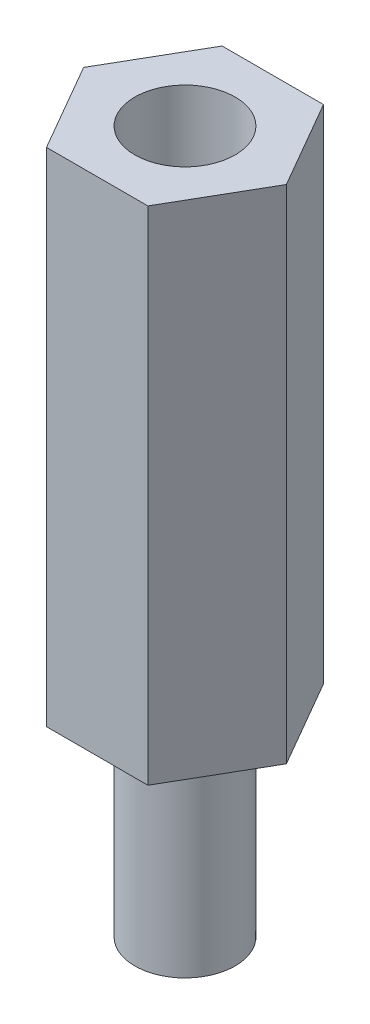
ISO-10303-21;
HEADER;
FILE_DESCRIPTION(('STEP AP214'),'2;1');
FILE_NAME('part.step','',(''),(''),'','','');
FILE_SCHEMA(('AUTOMOTIVE_DESIGN { 1 0 10303 214 1 1 1 1 }'));
ENDSEC;
DATA;
#1=APPLICATION_CONTEXT('core data for automotive mechanical design processes');
#2=APPLICATION_PROTOCOL_DEFINITION('international standard','automotive_design',2000,#1);
#3=PRODUCT_CONTEXT('',#1,'mechanical');
#4=PRODUCT('Part','Part','',(#3));
#5=PRODUCT_RELATED_PRODUCT_CATEGORY('part','',(#4));
#6=PRODUCT_DEFINITION_FORMATION('','',#4);
#7=PRODUCT_DEFINITION_CONTEXT('part definition',#1,'design');
#8=PRODUCT_DEFINITION('design','',#6,#7);
#9=PRODUCT_DEFINITION_SHAPE('','',#8);
#10=(LENGTH_UNIT() NAMED_UNIT(*) SI_UNIT(.MILLI.,.METRE.));
#11=(NAMED_UNIT(*) PLANE_ANGLE_UNIT() SI_UNIT($,.RADIAN.));
#12=(NAMED_UNIT(*) SI_UNIT($,.STERADIAN.) SOLID_ANGLE_UNIT());
#13=UNCERTAINTY_MEASURE_WITH_UNIT(LENGTH_MEASURE(1.E-05),#10,'distance_accuracy_value','');
#14=(GEOMETRIC_REPRESENTATION_CONTEXT(3) GLOBAL_UNCERTAINTY_ASSIGNED_CONTEXT((#13)) GLOBAL_UNIT_ASSIGNED_CONTEXT((#10,
#11,#12)) REPRESENTATION_CONTEXT('',''));
#15=CARTESIAN_POINT('',(0.,0.,0.));
#16=DIRECTION('',(0.,0.,1.));
#17=DIRECTION('',(1.,0.,0.));
#18=AXIS2_PLACEMENT_3D('',#15,#16,#17);
#19=CARTESIAN_POINT('',(0.,-8.,0.));
#20=DIRECTION('',(0.,1.,0.));
#21=DIRECTION('',(0.,0.,1.));
#22=AXIS2_PLACEMENT_3D('',#19,#20,#21);
#23=CYLINDRICAL_SURFACE('',#22,2.);
#24=CARTESIAN_POINT('',(0.,-8.,0.));
#25=DIRECTION('',(0.,-1.,0.));
#26=DIRECTION('',(0.,0.,-1.));
#27=AXIS2_PLACEMENT_3D('',#24,#25,#26);
#28=CIRCLE('',#27,2.);
#29=CARTESIAN_POINT('',(0.,-8.,-2.));
#30=VERTEX_POINT('',#29);
#31=EDGE_CURVE('E11',#30,#30,#28,.T.);
#32=ORIENTED_EDGE('',*,*,#31,.F.);
#33=EDGE_LOOP('',(#32));
#34=FACE_BOUND('',#33,.T.);
#35=CARTESIAN_POINT('',(0.,0.,0.));
#36=DIRECTION('',(0.,-1.,0.));
#37=DIRECTION('',(0.,0.,-1.));
#38=AXIS2_PLACEMENT_3D('',#35,#36,#37);
#39=CIRCLE('',#38,2.);
#40=CARTESIAN_POINT('',(0.,0.,-2.));
#41=VERTEX_POINT('',#40);
#42=EDGE_CURVE('E46',#41,#41,#39,.T.);
#43=ORIENTED_EDGE('',*,*,#42,.T.);
#44=EDGE_LOOP('',(#43));
#45=FACE_BOUND('',#44,.T.);
#46=ADVANCED_FACE('F43',(#34,#45),#23,.T.);
#47=CARTESIAN_POINT('',(0.,-8.,0.));
#48=DIRECTION('',(0.,-1.,0.));
#49=DIRECTION('',(0.,0.,-1.));
#50=AXIS2_PLACEMENT_3D('',#47,#48,#49);
#51=PLANE('',#50);
#52=ORIENTED_EDGE('',*,*,#31,.T.);
#53=EDGE_LOOP('',(#52));
#54=FACE_BOUND('',#53,.T.);
#55=ADVANCED_FACE('F58',(#54),#51,.T.);
#56=CARTESIAN_POINT('',(0.,0.,0.));
#57=DIRECTION('',(0.,-1.,0.));
#58=DIRECTION('',(0.,0.,-1.));
#59=AXIS2_PLACEMENT_3D('',#56,#57,#58);
#60=PLANE('',#59);
#61=ORIENTED_EDGE('',*,*,#42,.F.);
#62=EDGE_LOOP('',(#61));
#63=FACE_BOUND('',#62,.T.);
#64=ADVANCED_FACE('F56',(#63),#60,.F.);
#65=CLOSED_SHELL('',(#46,#55,#64));
#66=MANIFOLD_SOLID_BREP('B2',#65);
#67=CARTESIAN_POINT('',(0.,20.,0.));
#68=DIRECTION('',(0.,1.,0.));
#69=DIRECTION('',(0.,0.,1.));
#70=AXIS2_PLACEMENT_3D('',#67,#68,#69);
#71=PLANE('',#70);
#72=DIRECTION('',(0.5,0.,-0.866025403784439));
#73=VECTOR('',#72,1.);
#74=CARTESIAN_POINT('',(2.02072594216369,20.,3.5));
#75=LINE('',#74,#73);
#76=CARTESIAN_POINT('',(2.02072594216369,20.,3.5));
#77=VERTEX_POINT('',#76);
#78=CARTESIAN_POINT('',(4.04145188432738,20.,0.));
#79=VERTEX_POINT('',#78);
#80=EDGE_CURVE('E180',#77,#79,#75,.T.);
#81=ORIENTED_EDGE('',*,*,#80,.T.);
#82=DIRECTION('',(-0.5,0.,-0.866025403784438));
#83=VECTOR('',#82,1.);
#84=CARTESIAN_POINT('',(4.04145188432738,20.,0.));
#85=LINE('',#84,#83);
#86=CARTESIAN_POINT('',(2.02072594216369,20.,-3.5));
#87=VERTEX_POINT('',#86);
#88=EDGE_CURVE('E138',#79,#87,#85,.T.);
#89=ORIENTED_EDGE('',*,*,#88,.T.);
#90=DIRECTION('',(-1.,0.,0.));
#91=VECTOR('',#90,1.);
#92=CARTESIAN_POINT('',(2.02072594216369,20.,-3.5));
#93=LINE('',#92,#91);
#94=CARTESIAN_POINT('',(-2.02072594216369,20.,-3.5));
#95=VERTEX_POINT('',#94);
#96=EDGE_CURVE('E151',#87,#95,#93,.T.);
#97=ORIENTED_EDGE('',*,*,#96,.T.);
#98=DIRECTION('',(-0.5,0.,0.866025403784439));
#99=VECTOR('',#98,1.);
#100=CARTESIAN_POINT('',(-2.02072594216369,20.,-3.5));
#101=LINE('',#100,#99);
#102=CARTESIAN_POINT('',(-4.04145188432738,20.,0.));
#103=VERTEX_POINT('',#102);
#104=EDGE_CURVE('E145',#95,#103,#101,.T.);
#105=ORIENTED_EDGE('',*,*,#104,.T.);
#106=DIRECTION('',(0.5,0.,0.866025403784438));
#107=VECTOR('',#106,1.);
#108=CARTESIAN_POINT('',(-4.04145188432738,20.,0.));
#109=LINE('',#108,#107);
#110=CARTESIAN_POINT('',(-2.02072594216369,20.,3.5));
#111=VERTEX_POINT('',#110);
#112=EDGE_CURVE('E149',#103,#111,#109,.T.);
#113=ORIENTED_EDGE('',*,*,#112,.T.);
#114=DIRECTION('',(1.,0.,0.));
#115=VECTOR('',#114,1.);
#116=CARTESIAN_POINT('',(-2.02072594216369,20.,3.5));
#117=LINE('',#116,#115);
#118=EDGE_CURVE('E101',#111,#77,#117,.T.);
#119=ORIENTED_EDGE('',*,*,#118,.T.);
#120=EDGE_LOOP('',(#81,#89,#97,#105,#113,#119));
#121=FACE_BOUND('',#120,.T.);
#122=CARTESIAN_POINT('',(0.,20.,0.));
#123=DIRECTION('',(0.,1.,0.));
#124=DIRECTION('',(0.,0.,1.));
#125=AXIS2_PLACEMENT_3D('',#122,#123,#124);
#126=CIRCLE('',#125,2.);
#127=CARTESIAN_POINT('',(0.,20.,2.));
#128=VERTEX_POINT('',#127);
#129=EDGE_CURVE('E173',#128,#128,#126,.T.);
#130=ORIENTED_EDGE('',*,*,#129,.F.);
#131=EDGE_LOOP('',(#130));
#132=FACE_BOUND('',#131,.T.);
#133=ADVANCED_FACE('F84',(#121,#132),#71,.T.);
#134=CARTESIAN_POINT('',(0.,0.,0.));
#135=DIRECTION('',(0.,1.,0.));
#136=DIRECTION('',(0.,0.,1.));
#137=AXIS2_PLACEMENT_3D('',#134,#135,#136);
#138=PLANE('',#137);
#139=DIRECTION('',(0.5,0.,-0.866025403784439));
#140=VECTOR('',#139,1.);
#141=CARTESIAN_POINT('',(2.02072594216369,0.,3.5));
#142=LINE('',#141,#140);
#143=CARTESIAN_POINT('',(2.02072594216369,0.,3.5));
#144=VERTEX_POINT('',#143);
#145=CARTESIAN_POINT('',(4.04145188432738,0.,0.));
#146=VERTEX_POINT('',#145);
#147=EDGE_CURVE('E169',#144,#146,#142,.T.);
#148=ORIENTED_EDGE('',*,*,#147,.F.);
#149=DIRECTION('',(1.,0.,0.));
#150=VECTOR('',#149,1.);
#151=CARTESIAN_POINT('',(-2.02072594216369,0.,3.5));
#152=LINE('',#151,#150);
#153=CARTESIAN_POINT('',(-2.02072594216369,0.,3.5));
#154=VERTEX_POINT('',#153);
#155=EDGE_CURVE('E130',#154,#144,#152,.T.);
#156=ORIENTED_EDGE('',*,*,#155,.F.);
#157=DIRECTION('',(0.5,0.,0.866025403784438));
#158=VECTOR('',#157,1.);
#159=CARTESIAN_POINT('',(-4.04145188432738,0.,0.));
#160=LINE('',#159,#158);
#161=CARTESIAN_POINT('',(-4.04145188432738,0.,0.));
#162=VERTEX_POINT('',#161);
#163=EDGE_CURVE('E124',#162,#154,#160,.T.);
#164=ORIENTED_EDGE('',*,*,#163,.F.);
#165=DIRECTION('',(-0.5,0.,0.866025403784439));
#166=VECTOR('',#165,1.);
#167=CARTESIAN_POINT('',(-2.02072594216369,0.,-3.5));
#168=LINE('',#167,#166);
#169=CARTESIAN_POINT('',(-2.02072594216369,0.,-3.5));
#170=VERTEX_POINT('',#169);
#171=EDGE_CURVE('E159',#170,#162,#168,.T.);
#172=ORIENTED_EDGE('',*,*,#171,.F.);
#173=DIRECTION('',(-1.,0.,0.));
#174=VECTOR('',#173,1.);
#175=CARTESIAN_POINT('',(2.02072594216369,0.,-3.5));
#176=LINE('',#175,#174);
#177=CARTESIAN_POINT('',(2.02072594216369,0.,-3.5));
#178=VERTEX_POINT('',#177);
#179=EDGE_CURVE('E175',#178,#170,#176,.T.);
#180=ORIENTED_EDGE('',*,*,#179,.F.);
#181=DIRECTION('',(-0.5,0.,-0.866025403784438));
#182=VECTOR('',#181,1.);
#183=CARTESIAN_POINT('',(4.04145188432738,0.,0.));
#184=LINE('',#183,#182);
#185=EDGE_CURVE('E172',#146,#178,#184,.T.);
#186=ORIENTED_EDGE('',*,*,#185,.F.);
#187=EDGE_LOOP('',(#148,#156,#164,#172,#180,#186));
#188=FACE_BOUND('',#187,.T.);
#189=CARTESIAN_POINT('',(0.,0.,0.));
#190=DIRECTION('',(0.,1.,0.));
#191=DIRECTION('',(0.,0.,1.));
#192=AXIS2_PLACEMENT_3D('',#189,#190,#191);
#193=CIRCLE('',#192,2.);
#194=CARTESIAN_POINT('',(0.,0.,2.));
#195=VERTEX_POINT('',#194);
#196=EDGE_CURVE('E273',#195,#195,#193,.T.);
#197=ORIENTED_EDGE('',*,*,#196,.T.);
#198=EDGE_LOOP('',(#197));
#199=FACE_BOUND('',#198,.T.);
#200=ADVANCED_FACE('F189',(#188,#199),#138,.F.);
#201=CARTESIAN_POINT('',(2.02072594216369,20.,3.5));
#202=DIRECTION('',(-0.866025403784439,0.,-0.5));
#203=DIRECTION('',(-0.5,0.,0.866025403784439));
#204=AXIS2_PLACEMENT_3D('',#201,#202,#203);
#205=PLANE('',#204);
#206=ORIENTED_EDGE('',*,*,#147,.T.);
#207=DIRECTION('',(0.,-1.,0.));
#208=VECTOR('',#207,1.);
#209=CARTESIAN_POINT('',(4.04145188432738,20.,0.));
#210=LINE('',#209,#208);
#211=EDGE_CURVE('E41',#79,#146,#210,.T.);
#212=ORIENTED_EDGE('',*,*,#211,.F.);
#213=ORIENTED_EDGE('',*,*,#80,.F.);
#214=DIRECTION('',(0.,-1.,0.));
#215=VECTOR('',#214,1.);
#216=CARTESIAN_POINT('',(2.02072594216369,20.,3.5));
#217=LINE('',#216,#215);
#218=EDGE_CURVE('E165',#77,#144,#217,.T.);
#219=ORIENTED_EDGE('',*,*,#218,.T.);
#220=EDGE_LOOP('',(#206,#212,#213,#219));
#221=FACE_BOUND('',#220,.T.);
#222=ADVANCED_FACE('F86',(#221),#205,.F.);
#223=CARTESIAN_POINT('',(4.04145188432738,20.,0.));
#224=DIRECTION('',(-0.866025403784438,0.,0.5));
#225=DIRECTION('',(0.5,0.,0.866025403784439));
#226=AXIS2_PLACEMENT_3D('',#223,#224,#225);
#227=PLANE('',#226);
#228=ORIENTED_EDGE('',*,*,#185,.T.);
#229=DIRECTION('',(0.,-1.,0.));
#230=VECTOR('',#229,1.);
#231=CARTESIAN_POINT('',(2.02072594216369,20.,-3.5));
#232=LINE('',#231,#230);
#233=EDGE_CURVE('E93',#87,#178,#232,.T.);
#234=ORIENTED_EDGE('',*,*,#233,.F.);
#235=ORIENTED_EDGE('',*,*,#88,.F.);
#236=ORIENTED_EDGE('',*,*,#211,.T.);
#237=EDGE_LOOP('',(#228,#234,#235,#236));
#238=FACE_BOUND('',#237,.T.);
#239=ADVANCED_FACE('F214',(#238),#227,.F.);
#240=CARTESIAN_POINT('',(2.02072594216369,20.,-3.5));
#241=DIRECTION('',(0.,0.,1.));
#242=DIRECTION('',(1.,0.,0.));
#243=AXIS2_PLACEMENT_3D('',#240,#241,#242);
#244=PLANE('',#243);
#245=ORIENTED_EDGE('',*,*,#179,.T.);
#246=DIRECTION('',(0.,-1.,0.));
#247=VECTOR('',#246,1.);
#248=CARTESIAN_POINT('',(-2.02072594216369,20.,-3.5));
#249=LINE('',#248,#247);
#250=EDGE_CURVE('E160',#95,#170,#249,.T.);
#251=ORIENTED_EDGE('',*,*,#250,.F.);
#252=ORIENTED_EDGE('',*,*,#96,.F.);
#253=ORIENTED_EDGE('',*,*,#233,.T.);
#254=EDGE_LOOP('',(#245,#251,#252,#253));
#255=FACE_BOUND('',#254,.T.);
#256=ADVANCED_FACE('F186',(#255),#244,.F.);
#257=CARTESIAN_POINT('',(-2.02072594216369,20.,-3.5));
#258=DIRECTION('',(0.866025403784439,0.,0.5));
#259=DIRECTION('',(0.5,0.,-0.866025403784439));
#260=AXIS2_PLACEMENT_3D('',#257,#258,#259);
#261=PLANE('',#260);
#262=ORIENTED_EDGE('',*,*,#171,.T.);
#263=DIRECTION('',(0.,-1.,0.));
#264=VECTOR('',#263,1.);
#265=CARTESIAN_POINT('',(-4.04145188432738,20.,0.));
#266=LINE('',#265,#264);
#267=EDGE_CURVE('E156',#103,#162,#266,.T.);
#268=ORIENTED_EDGE('',*,*,#267,.F.);
#269=ORIENTED_EDGE('',*,*,#104,.F.);
#270=ORIENTED_EDGE('',*,*,#250,.T.);
#271=EDGE_LOOP('',(#262,#268,#269,#270));
#272=FACE_BOUND('',#271,.T.);
#273=ADVANCED_FACE('F157',(#272),#261,.F.);
#274=CARTESIAN_POINT('',(-4.04145188432738,20.,0.));
#275=DIRECTION('',(0.866025403784438,0.,-0.5));
#276=DIRECTION('',(-0.5,0.,-0.866025403784438));
#277=AXIS2_PLACEMENT_3D('',#274,#275,#276);
#278=PLANE('',#277);
#279=ORIENTED_EDGE('',*,*,#163,.T.);
#280=DIRECTION('',(0.,-1.,0.));
#281=VECTOR('',#280,1.);
#282=CARTESIAN_POINT('',(-2.02072594216369,20.,3.5));
#283=LINE('',#282,#281);
#284=EDGE_CURVE('E161',#111,#154,#283,.T.);
#285=ORIENTED_EDGE('',*,*,#284,.F.);
#286=ORIENTED_EDGE('',*,*,#112,.F.);
#287=ORIENTED_EDGE('',*,*,#267,.T.);
#288=EDGE_LOOP('',(#279,#285,#286,#287));
#289=FACE_BOUND('',#288,.T.);
#290=ADVANCED_FACE('F163',(#289),#278,.F.);
#291=CARTESIAN_POINT('',(-2.02072594216369,20.,3.5));
#292=DIRECTION('',(0.,0.,-1.));
#293=DIRECTION('',(-1.,0.,0.));
#294=AXIS2_PLACEMENT_3D('',#291,#292,#293);
#295=PLANE('',#294);
#296=ORIENTED_EDGE('',*,*,#155,.T.);
#297=ORIENTED_EDGE('',*,*,#218,.F.);
#298=ORIENTED_EDGE('',*,*,#118,.F.);
#299=ORIENTED_EDGE('',*,*,#284,.T.);
#300=EDGE_LOOP('',(#296,#297,#298,#299));
#301=FACE_BOUND('',#300,.T.);
#302=ADVANCED_FACE('F194',(#301),#295,.F.);
#303=CARTESIAN_POINT('',(0.,20.,0.));
#304=DIRECTION('',(0.,-1.,0.));
#305=DIRECTION('',(0.,0.,-1.));
#306=AXIS2_PLACEMENT_3D('',#303,#304,#305);
#307=CYLINDRICAL_SURFACE('',#306,2.);
#308=ORIENTED_EDGE('',*,*,#129,.T.);
#309=EDGE_LOOP('',(#308));
#310=FACE_BOUND('',#309,.T.);
#311=ORIENTED_EDGE('',*,*,#196,.F.);
#312=EDGE_LOOP('',(#311));
#313=FACE_BOUND('',#312,.T.);
#314=ADVANCED_FACE('F196',(#310,#313),#307,.F.);
#315=CLOSED_SHELL('',(#133,#200,#222,#239,#256,#273,#290,#302,#314));
#316=MANIFOLD_SOLID_BREP('B6',#315);
#317=ADVANCED_BREP_SHAPE_REPRESENTATION('',(#18,#66,#316),#14);
#318=SHAPE_DEFINITION_REPRESENTATION(#9,#317);
ENDSEC;
END-ISO-10303-21;
